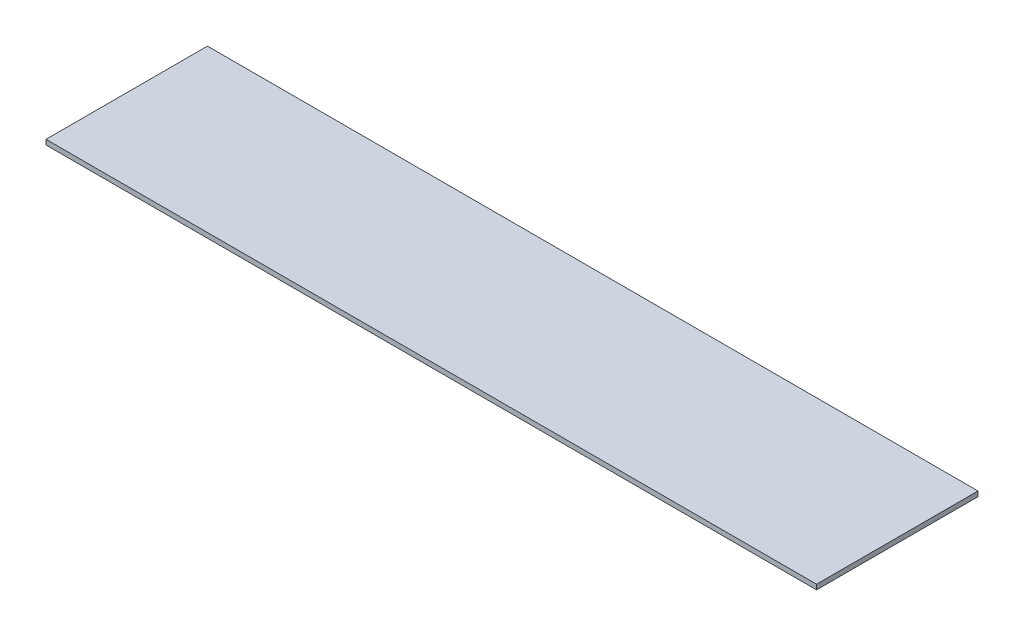
ISO-10303-21;
HEADER;
FILE_DESCRIPTION(('STEP AP214'),'2;1');
FILE_NAME('part.step','',(''),(''),'','','');
FILE_SCHEMA(('AUTOMOTIVE_DESIGN { 1 0 10303 214 1 1 1 1 }'));
ENDSEC;
DATA;
#1=APPLICATION_CONTEXT('core data for automotive mechanical design processes');
#2=APPLICATION_PROTOCOL_DEFINITION('international standard','automotive_design',2000,#1);
#3=PRODUCT_CONTEXT('',#1,'mechanical');
#4=PRODUCT('Part','Part','',(#3));
#5=PRODUCT_RELATED_PRODUCT_CATEGORY('part','',(#4));
#6=PRODUCT_DEFINITION_FORMATION('','',#4);
#7=PRODUCT_DEFINITION_CONTEXT('part definition',#1,'design');
#8=PRODUCT_DEFINITION('design','',#6,#7);
#9=PRODUCT_DEFINITION_SHAPE('','',#8);
#10=(LENGTH_UNIT() NAMED_UNIT(*) SI_UNIT(.MILLI.,.METRE.));
#11=(NAMED_UNIT(*) PLANE_ANGLE_UNIT() SI_UNIT($,.RADIAN.));
#12=(NAMED_UNIT(*) SI_UNIT($,.STERADIAN.) SOLID_ANGLE_UNIT());
#13=UNCERTAINTY_MEASURE_WITH_UNIT(LENGTH_MEASURE(1.E-05),#10,'distance_accuracy_value','');
#14=(GEOMETRIC_REPRESENTATION_CONTEXT(3) GLOBAL_UNCERTAINTY_ASSIGNED_CONTEXT((#13)) GLOBAL_UNIT_ASSIGNED_CONTEXT((#10,
#11,#12)) REPRESENTATION_CONTEXT('',''));
#15=CARTESIAN_POINT('',(0.,0.,0.));
#16=DIRECTION('',(0.,0.,1.));
#17=DIRECTION('',(1.,0.,0.));
#18=AXIS2_PLACEMENT_3D('',#15,#16,#17);
#19=CARTESIAN_POINT('',(0.,1.5875,0.));
#20=DIRECTION('',(1.,0.,0.));
#21=DIRECTION('',(0.,0.,-1.));
#22=AXIS2_PLACEMENT_3D('',#19,#20,#21);
#23=PLANE('',#22);
#24=DIRECTION('',(0.,0.,1.));
#25=VECTOR('',#24,1.);
#26=CARTESIAN_POINT('',(0.,0.,0.));
#27=LINE('',#26,#25);
#28=CARTESIAN_POINT('',(0.,0.,0.));
#29=VERTEX_POINT('',#28);
#30=CARTESIAN_POINT('',(0.,0.,51.8899679889758));
#31=VERTEX_POINT('',#30);
#32=EDGE_CURVE('E106',#29,#31,#27,.T.);
#33=ORIENTED_EDGE('',*,*,#32,.T.);
#34=DIRECTION('',(0.,-1.,0.));
#35=VECTOR('',#34,1.);
#36=CARTESIAN_POINT('',(0.,1.5875,51.8899679889758));
#37=LINE('',#36,#35);
#38=CARTESIAN_POINT('',(0.,1.5875,51.8899679889758));
#39=VERTEX_POINT('',#38);
#40=EDGE_CURVE('E11',#39,#31,#37,.T.);
#41=ORIENTED_EDGE('',*,*,#40,.F.);
#42=DIRECTION('',(0.,0.,1.));
#43=VECTOR('',#42,1.);
#44=CARTESIAN_POINT('',(0.,1.5875,0.));
#45=LINE('',#44,#43);
#46=CARTESIAN_POINT('',(0.,1.5875,0.));
#47=VERTEX_POINT('',#46);
#48=EDGE_CURVE('E94',#47,#39,#45,.T.);
#49=ORIENTED_EDGE('',*,*,#48,.F.);
#50=DIRECTION('',(0.,-1.,0.));
#51=VECTOR('',#50,1.);
#52=CARTESIAN_POINT('',(0.,1.5875,0.));
#53=LINE('',#52,#51);
#54=EDGE_CURVE('E102',#47,#29,#53,.T.);
#55=ORIENTED_EDGE('',*,*,#54,.T.);
#56=EDGE_LOOP('',(#33,#41,#49,#55));
#57=FACE_BOUND('',#56,.T.);
#58=ADVANCED_FACE('F43',(#57),#23,.F.);
#59=CARTESIAN_POINT('',(0.,1.5875,51.8899679889758));
#60=DIRECTION('',(0.,0.,-1.));
#61=DIRECTION('',(-1.,0.,0.));
#62=AXIS2_PLACEMENT_3D('',#59,#60,#61);
#63=PLANE('',#62);
#64=DIRECTION('',(1.,0.,0.));
#65=VECTOR('',#64,1.);
#66=CARTESIAN_POINT('',(0.,0.,51.8899679889758));
#67=LINE('',#66,#65);
#68=CARTESIAN_POINT('',(247.65,0.,51.8899679889758));
#69=VERTEX_POINT('',#68);
#70=EDGE_CURVE('E98',#31,#69,#67,.T.);
#71=ORIENTED_EDGE('',*,*,#70,.T.);
#72=DIRECTION('',(0.,-1.,0.));
#73=VECTOR('',#72,1.);
#74=CARTESIAN_POINT('',(247.65,1.5875,51.8899679889758));
#75=LINE('',#74,#73);
#76=CARTESIAN_POINT('',(247.65,1.5875,51.8899679889758));
#77=VERTEX_POINT('',#76);
#78=EDGE_CURVE('E51',#77,#69,#75,.T.);
#79=ORIENTED_EDGE('',*,*,#78,.F.);
#80=DIRECTION('',(1.,0.,0.));
#81=VECTOR('',#80,1.);
#82=CARTESIAN_POINT('',(0.,1.5875,51.8899679889758));
#83=LINE('',#82,#81);
#84=EDGE_CURVE('E89',#39,#77,#83,.T.);
#85=ORIENTED_EDGE('',*,*,#84,.F.);
#86=ORIENTED_EDGE('',*,*,#40,.T.);
#87=EDGE_LOOP('',(#71,#79,#85,#86));
#88=FACE_BOUND('',#87,.T.);
#89=ADVANCED_FACE('F97',(#88),#63,.F.);
#90=CARTESIAN_POINT('',(247.65,1.5875,0.));
#91=DIRECTION('',(-1.,0.,0.));
#92=DIRECTION('',(0.,0.,1.));
#93=AXIS2_PLACEMENT_3D('',#90,#91,#92);
#94=PLANE('',#93);
#95=DIRECTION('',(0.,0.,-1.));
#96=VECTOR('',#95,1.);
#97=CARTESIAN_POINT('',(247.65,0.,0.));
#98=LINE('',#97,#96);
#99=CARTESIAN_POINT('',(247.65,0.,0.));
#100=VERTEX_POINT('',#99);
#101=EDGE_CURVE('E76',#69,#100,#98,.T.);
#102=ORIENTED_EDGE('',*,*,#101,.T.);
#103=DIRECTION('',(0.,-1.,0.));
#104=VECTOR('',#103,1.);
#105=CARTESIAN_POINT('',(247.65,1.5875,0.));
#106=LINE('',#105,#104);
#107=CARTESIAN_POINT('',(247.65,1.5875,0.));
#108=VERTEX_POINT('',#107);
#109=EDGE_CURVE('E99',#108,#100,#106,.T.);
#110=ORIENTED_EDGE('',*,*,#109,.F.);
#111=DIRECTION('',(0.,0.,-1.));
#112=VECTOR('',#111,1.);
#113=CARTESIAN_POINT('',(247.65,1.5875,0.));
#114=LINE('',#113,#112);
#115=EDGE_CURVE('E92',#77,#108,#114,.T.);
#116=ORIENTED_EDGE('',*,*,#115,.F.);
#117=ORIENTED_EDGE('',*,*,#78,.T.);
#118=EDGE_LOOP('',(#102,#110,#116,#117));
#119=FACE_BOUND('',#118,.T.);
#120=ADVANCED_FACE('F100',(#119),#94,.F.);
#121=CARTESIAN_POINT('',(0.,1.5875,0.));
#122=DIRECTION('',(0.,0.,1.));
#123=DIRECTION('',(1.,0.,0.));
#124=AXIS2_PLACEMENT_3D('',#121,#122,#123);
#125=PLANE('',#124);
#126=DIRECTION('',(-1.,0.,0.));
#127=VECTOR('',#126,1.);
#128=CARTESIAN_POINT('',(0.,0.,0.));
#129=LINE('',#128,#127);
#130=EDGE_CURVE('E82',#100,#29,#129,.T.);
#131=ORIENTED_EDGE('',*,*,#130,.T.);
#132=ORIENTED_EDGE('',*,*,#54,.F.);
#133=DIRECTION('',(-1.,0.,0.));
#134=VECTOR('',#133,1.);
#135=CARTESIAN_POINT('',(0.,1.5875,0.));
#136=LINE('',#135,#134);
#137=EDGE_CURVE('E59',#108,#47,#136,.T.);
#138=ORIENTED_EDGE('',*,*,#137,.F.);
#139=ORIENTED_EDGE('',*,*,#109,.T.);
#140=EDGE_LOOP('',(#131,#132,#138,#139));
#141=FACE_BOUND('',#140,.T.);
#142=ADVANCED_FACE('F113',(#141),#125,.F.);
#143=CARTESIAN_POINT('',(0.,1.5875,0.));
#144=DIRECTION('',(0.,1.,0.));
#145=DIRECTION('',(0.,0.,1.));
#146=AXIS2_PLACEMENT_3D('',#143,#144,#145);
#147=PLANE('',#146);
#148=ORIENTED_EDGE('',*,*,#48,.T.);
#149=ORIENTED_EDGE('',*,*,#84,.T.);
#150=ORIENTED_EDGE('',*,*,#115,.T.);
#151=ORIENTED_EDGE('',*,*,#137,.T.);
#152=EDGE_LOOP('',(#148,#149,#150,#151));
#153=FACE_BOUND('',#152,.T.);
#154=ADVANCED_FACE('F90',(#153),#147,.T.);
#155=CARTESIAN_POINT('',(0.,0.,0.));
#156=DIRECTION('',(0.,1.,0.));
#157=DIRECTION('',(0.,0.,1.));
#158=AXIS2_PLACEMENT_3D('',#155,#156,#157);
#159=PLANE('',#158);
#160=ORIENTED_EDGE('',*,*,#32,.F.);
#161=ORIENTED_EDGE('',*,*,#130,.F.);
#162=ORIENTED_EDGE('',*,*,#101,.F.);
#163=ORIENTED_EDGE('',*,*,#70,.F.);
#164=EDGE_LOOP('',(#160,#161,#162,#163));
#165=FACE_BOUND('',#164,.T.);
#166=ADVANCED_FACE('F116',(#165),#159,.F.);
#167=CLOSED_SHELL('',(#58,#89,#120,#142,#154,#166));
#168=MANIFOLD_SOLID_BREP('B2',#167);
#169=ADVANCED_BREP_SHAPE_REPRESENTATION('',(#18,#168),#14);
#170=SHAPE_DEFINITION_REPRESENTATION(#9,#169);
ENDSEC;
END-ISO-10303-21;
